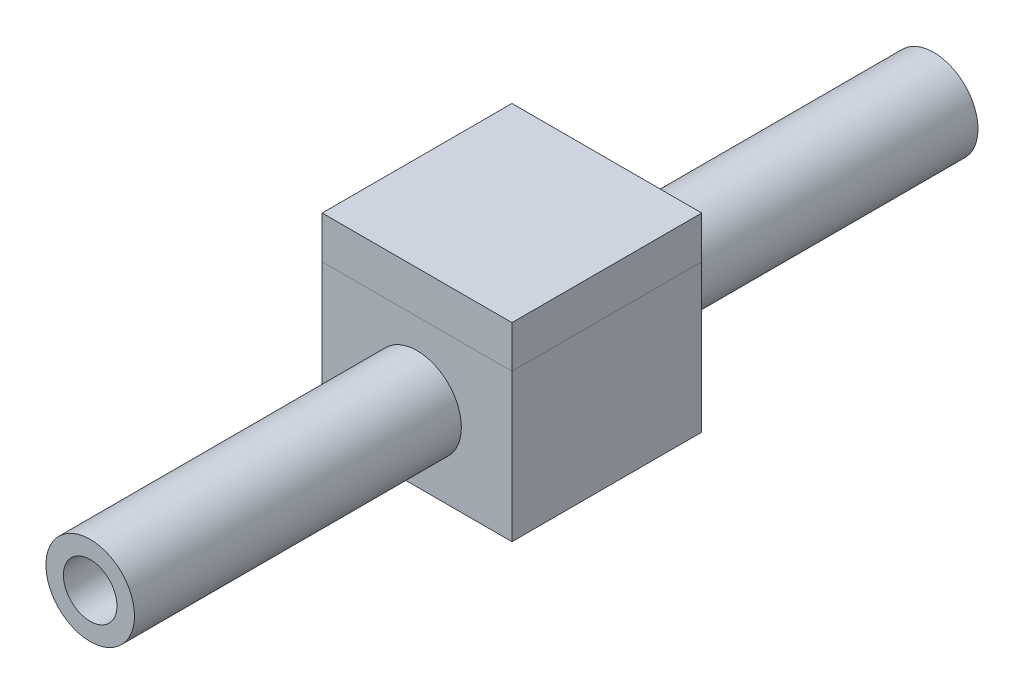
ISO-10303-21;
HEADER;
FILE_DESCRIPTION(('STEP AP214'),'2;1');
FILE_NAME('part.step','',(''),(''),'','','');
FILE_SCHEMA(('AUTOMOTIVE_DESIGN { 1 0 10303 214 1 1 1 1 }'));
ENDSEC;
DATA;
#1=APPLICATION_CONTEXT('core data for automotive mechanical design processes');
#2=APPLICATION_PROTOCOL_DEFINITION('international standard','automotive_design',2000,#1);
#3=PRODUCT_CONTEXT('',#1,'mechanical');
#4=PRODUCT('Part','Part','',(#3));
#5=PRODUCT_RELATED_PRODUCT_CATEGORY('part','',(#4));
#6=PRODUCT_DEFINITION_FORMATION('','',#4);
#7=PRODUCT_DEFINITION_CONTEXT('part definition',#1,'design');
#8=PRODUCT_DEFINITION('design','',#6,#7);
#9=PRODUCT_DEFINITION_SHAPE('','',#8);
#10=(LENGTH_UNIT() NAMED_UNIT(*) SI_UNIT(.MILLI.,.METRE.));
#11=(NAMED_UNIT(*) PLANE_ANGLE_UNIT() SI_UNIT($,.RADIAN.));
#12=(NAMED_UNIT(*) SI_UNIT($,.STERADIAN.) SOLID_ANGLE_UNIT());
#13=UNCERTAINTY_MEASURE_WITH_UNIT(LENGTH_MEASURE(1.E-05),#10,'distance_accuracy_value','');
#14=(GEOMETRIC_REPRESENTATION_CONTEXT(3) GLOBAL_UNCERTAINTY_ASSIGNED_CONTEXT((#13)) GLOBAL_UNIT_ASSIGNED_CONTEXT((#10,
#11,#12)) REPRESENTATION_CONTEXT('',''));
#15=CARTESIAN_POINT('',(0.,0.,0.));
#16=DIRECTION('',(0.,0.,1.));
#17=DIRECTION('',(1.,0.,0.));
#18=AXIS2_PLACEMENT_3D('',#15,#16,#17);
#19=CARTESIAN_POINT('',(-22.5,0.,45.));
#20=DIRECTION('',(1.,0.,0.));
#21=DIRECTION('',(0.,0.,-1.));
#22=AXIS2_PLACEMENT_3D('',#19,#20,#21);
#23=PLANE('',#22);
#24=DIRECTION('',(0.,-1.,0.));
#25=VECTOR('',#24,1.);
#26=CARTESIAN_POINT('',(-22.5,0.,0.));
#27=LINE('',#26,#25);
#28=CARTESIAN_POINT('',(-22.5,27.5,0.));
#29=VERTEX_POINT('',#28);
#30=CARTESIAN_POINT('',(-22.5,17.5,0.));
#31=VERTEX_POINT('',#30);
#32=EDGE_CURVE('E112',#29,#31,#27,.T.);
#33=ORIENTED_EDGE('',*,*,#32,.T.);
#34=DIRECTION('',(0.,0.,-1.));
#35=VECTOR('',#34,1.);
#36=CARTESIAN_POINT('',(-22.5,17.5,45.));
#37=LINE('',#36,#35);
#38=CARTESIAN_POINT('',(-22.5,17.5,45.));
#39=VERTEX_POINT('',#38);
#40=EDGE_CURVE('E12',#39,#31,#37,.T.);
#41=ORIENTED_EDGE('',*,*,#40,.F.);
#42=DIRECTION('',(0.,-1.,0.));
#43=VECTOR('',#42,1.);
#44=CARTESIAN_POINT('',(-22.5,0.,45.));
#45=LINE('',#44,#43);
#46=CARTESIAN_POINT('',(-22.5,27.5,45.));
#47=VERTEX_POINT('',#46);
#48=EDGE_CURVE('E100',#47,#39,#45,.T.);
#49=ORIENTED_EDGE('',*,*,#48,.F.);
#50=DIRECTION('',(0.,0.,-1.));
#51=VECTOR('',#50,1.);
#52=CARTESIAN_POINT('',(-22.5,27.5,45.));
#53=LINE('',#52,#51);
#54=EDGE_CURVE('E108',#47,#29,#53,.T.);
#55=ORIENTED_EDGE('',*,*,#54,.T.);
#56=EDGE_LOOP('',(#33,#41,#49,#55));
#57=FACE_BOUND('',#56,.T.);
#58=ADVANCED_FACE('F49',(#57),#23,.F.);
#59=CARTESIAN_POINT('',(0.,17.5,45.));
#60=DIRECTION('',(0.,1.,0.));
#61=DIRECTION('',(-1.,0.,0.));
#62=AXIS2_PLACEMENT_3D('',#59,#60,#61);
#63=PLANE('',#62);
#64=DIRECTION('',(1.,0.,0.));
#65=VECTOR('',#64,1.);
#66=CARTESIAN_POINT('',(0.,17.5,0.));
#67=LINE('',#66,#65);
#68=CARTESIAN_POINT('',(22.5,17.5,0.));
#69=VERTEX_POINT('',#68);
#70=EDGE_CURVE('E104',#31,#69,#67,.T.);
#71=ORIENTED_EDGE('',*,*,#70,.T.);
#72=DIRECTION('',(0.,0.,-1.));
#73=VECTOR('',#72,1.);
#74=CARTESIAN_POINT('',(22.5,17.5,45.));
#75=LINE('',#74,#73);
#76=CARTESIAN_POINT('',(22.5,17.5,45.));
#77=VERTEX_POINT('',#76);
#78=EDGE_CURVE('E57',#77,#69,#75,.T.);
#79=ORIENTED_EDGE('',*,*,#78,.F.);
#80=DIRECTION('',(1.,0.,0.));
#81=VECTOR('',#80,1.);
#82=CARTESIAN_POINT('',(0.,17.5,45.));
#83=LINE('',#82,#81);
#84=EDGE_CURVE('E95',#39,#77,#83,.T.);
#85=ORIENTED_EDGE('',*,*,#84,.F.);
#86=ORIENTED_EDGE('',*,*,#40,.T.);
#87=EDGE_LOOP('',(#71,#79,#85,#86));
#88=FACE_BOUND('',#87,.T.);
#89=ADVANCED_FACE('F103',(#88),#63,.F.);
#90=CARTESIAN_POINT('',(22.5,0.,45.));
#91=DIRECTION('',(-1.,0.,0.));
#92=DIRECTION('',(0.,0.,1.));
#93=AXIS2_PLACEMENT_3D('',#90,#91,#92);
#94=PLANE('',#93);
#95=DIRECTION('',(0.,1.,0.));
#96=VECTOR('',#95,1.);
#97=CARTESIAN_POINT('',(22.5,0.,0.));
#98=LINE('',#97,#96);
#99=CARTESIAN_POINT('',(22.5,27.5,0.));
#100=VERTEX_POINT('',#99);
#101=EDGE_CURVE('E82',#69,#100,#98,.T.);
#102=ORIENTED_EDGE('',*,*,#101,.T.);
#103=DIRECTION('',(0.,0.,-1.));
#104=VECTOR('',#103,1.);
#105=CARTESIAN_POINT('',(22.5,27.5,45.));
#106=LINE('',#105,#104);
#107=CARTESIAN_POINT('',(22.5,27.5,45.));
#108=VERTEX_POINT('',#107);
#109=EDGE_CURVE('E105',#108,#100,#106,.T.);
#110=ORIENTED_EDGE('',*,*,#109,.F.);
#111=DIRECTION('',(0.,1.,0.));
#112=VECTOR('',#111,1.);
#113=CARTESIAN_POINT('',(22.5,0.,45.));
#114=LINE('',#113,#112);
#115=EDGE_CURVE('E98',#77,#108,#114,.T.);
#116=ORIENTED_EDGE('',*,*,#115,.F.);
#117=ORIENTED_EDGE('',*,*,#78,.T.);
#118=EDGE_LOOP('',(#102,#110,#116,#117));
#119=FACE_BOUND('',#118,.T.);
#120=ADVANCED_FACE('F106',(#119),#94,.F.);
#121=CARTESIAN_POINT('',(0.,27.5,45.));
#122=DIRECTION('',(0.,-1.,0.));
#123=DIRECTION('',(1.,0.,0.));
#124=AXIS2_PLACEMENT_3D('',#121,#122,#123);
#125=PLANE('',#124);
#126=DIRECTION('',(-1.,0.,0.));
#127=VECTOR('',#126,1.);
#128=CARTESIAN_POINT('',(0.,27.5,0.));
#129=LINE('',#128,#127);
#130=EDGE_CURVE('E88',#100,#29,#129,.T.);
#131=ORIENTED_EDGE('',*,*,#130,.T.);
#132=ORIENTED_EDGE('',*,*,#54,.F.);
#133=DIRECTION('',(-1.,0.,0.));
#134=VECTOR('',#133,1.);
#135=CARTESIAN_POINT('',(0.,27.5,45.));
#136=LINE('',#135,#134);
#137=EDGE_CURVE('E65',#108,#47,#136,.T.);
#138=ORIENTED_EDGE('',*,*,#137,.F.);
#139=ORIENTED_EDGE('',*,*,#109,.T.);
#140=EDGE_LOOP('',(#131,#132,#138,#139));
#141=FACE_BOUND('',#140,.T.);
#142=ADVANCED_FACE('F119',(#141),#125,.F.);
#143=CARTESIAN_POINT('',(0.,0.,45.));
#144=DIRECTION('',(0.,0.,1.));
#145=DIRECTION('',(1.,0.,0.));
#146=AXIS2_PLACEMENT_3D('',#143,#144,#145);
#147=PLANE('',#146);
#148=ORIENTED_EDGE('',*,*,#48,.T.);
#149=ORIENTED_EDGE('',*,*,#84,.T.);
#150=ORIENTED_EDGE('',*,*,#115,.T.);
#151=ORIENTED_EDGE('',*,*,#137,.T.);
#152=EDGE_LOOP('',(#148,#149,#150,#151));
#153=FACE_BOUND('',#152,.T.);
#154=ADVANCED_FACE('F96',(#153),#147,.T.);
#155=CARTESIAN_POINT('',(0.,0.,0.));
#156=DIRECTION('',(0.,0.,1.));
#157=DIRECTION('',(1.,0.,0.));
#158=AXIS2_PLACEMENT_3D('',#155,#156,#157);
#159=PLANE('',#158);
#160=ORIENTED_EDGE('',*,*,#32,.F.);
#161=ORIENTED_EDGE('',*,*,#130,.F.);
#162=ORIENTED_EDGE('',*,*,#101,.F.);
#163=ORIENTED_EDGE('',*,*,#70,.F.);
#164=EDGE_LOOP('',(#160,#161,#162,#163));
#165=FACE_BOUND('',#164,.T.);
#166=ADVANCED_FACE('F122',(#165),#159,.F.);
#167=CLOSED_SHELL('',(#58,#89,#120,#142,#154,#166));
#168=MANIFOLD_SOLID_BREP('B2',#167);
#169=CARTESIAN_POINT('',(-22.5,0.,45.));
#170=DIRECTION('',(1.,0.,0.));
#171=DIRECTION('',(0.,0.,-1.));
#172=AXIS2_PLACEMENT_3D('',#169,#170,#171);
#173=PLANE('',#172);
#174=DIRECTION('',(0.,-1.,0.));
#175=VECTOR('',#174,1.);
#176=CARTESIAN_POINT('',(-22.5,0.,0.));
#177=LINE('',#176,#175);
#178=CARTESIAN_POINT('',(-22.5,17.5,0.));
#179=VERTEX_POINT('',#178);
#180=CARTESIAN_POINT('',(-22.5,-17.5,0.));
#181=VERTEX_POINT('',#180);
#182=EDGE_CURVE('E248',#179,#181,#177,.T.);
#183=ORIENTED_EDGE('',*,*,#182,.T.);
#184=DIRECTION('',(0.,0.,-1.));
#185=VECTOR('',#184,1.);
#186=CARTESIAN_POINT('',(-22.5,-17.5,45.));
#187=LINE('',#186,#185);
#188=CARTESIAN_POINT('',(-22.5,-17.5,45.));
#189=VERTEX_POINT('',#188);
#190=EDGE_CURVE('E47',#189,#181,#187,.T.);
#191=ORIENTED_EDGE('',*,*,#190,.F.);
#192=DIRECTION('',(0.,-1.,0.));
#193=VECTOR('',#192,1.);
#194=CARTESIAN_POINT('',(-22.5,0.,45.));
#195=LINE('',#194,#193);
#196=CARTESIAN_POINT('',(-22.5,17.5,45.));
#197=VERTEX_POINT('',#196);
#198=EDGE_CURVE('E234',#197,#189,#195,.T.);
#199=ORIENTED_EDGE('',*,*,#198,.F.);
#200=DIRECTION('',(0.,0.,-1.));
#201=VECTOR('',#200,1.);
#202=CARTESIAN_POINT('',(-22.5,17.5,45.));
#203=LINE('',#202,#201);
#204=EDGE_CURVE('E201',#197,#179,#203,.T.);
#205=ORIENTED_EDGE('',*,*,#204,.T.);
#206=EDGE_LOOP('',(#183,#191,#199,#205));
#207=FACE_BOUND('',#206,.T.);
#208=ADVANCED_FACE('F185',(#207),#173,.F.);
#209=CARTESIAN_POINT('',(0.,-17.5,45.));
#210=DIRECTION('',(0.,1.,0.));
#211=DIRECTION('',(-1.,0.,0.));
#212=AXIS2_PLACEMENT_3D('',#209,#210,#211);
#213=PLANE('',#212);
#214=DIRECTION('',(1.,0.,0.));
#215=VECTOR('',#214,1.);
#216=CARTESIAN_POINT('',(0.,-17.5,0.));
#217=LINE('',#216,#215);
#218=CARTESIAN_POINT('',(22.5,-17.5,0.));
#219=VERTEX_POINT('',#218);
#220=EDGE_CURVE('E239',#181,#219,#217,.T.);
#221=ORIENTED_EDGE('',*,*,#220,.T.);
#222=DIRECTION('',(0.,0.,-1.));
#223=VECTOR('',#222,1.);
#224=CARTESIAN_POINT('',(22.5,-17.5,45.));
#225=LINE('',#224,#223);
#226=CARTESIAN_POINT('',(22.5,-17.5,45.));
#227=VERTEX_POINT('',#226);
#228=EDGE_CURVE('E193',#227,#219,#225,.T.);
#229=ORIENTED_EDGE('',*,*,#228,.F.);
#230=DIRECTION('',(1.,0.,0.));
#231=VECTOR('',#230,1.);
#232=CARTESIAN_POINT('',(0.,-17.5,45.));
#233=LINE('',#232,#231);
#234=EDGE_CURVE('E227',#189,#227,#233,.T.);
#235=ORIENTED_EDGE('',*,*,#234,.F.);
#236=ORIENTED_EDGE('',*,*,#190,.T.);
#237=EDGE_LOOP('',(#221,#229,#235,#236));
#238=FACE_BOUND('',#237,.T.);
#239=ADVANCED_FACE('F238',(#238),#213,.F.);
#240=CARTESIAN_POINT('',(22.5,0.,45.));
#241=DIRECTION('',(-1.,0.,0.));
#242=DIRECTION('',(0.,0.,1.));
#243=AXIS2_PLACEMENT_3D('',#240,#241,#242);
#244=PLANE('',#243);
#245=DIRECTION('',(0.,1.,0.));
#246=VECTOR('',#245,1.);
#247=CARTESIAN_POINT('',(22.5,0.,0.));
#248=LINE('',#247,#246);
#249=CARTESIAN_POINT('',(22.5,17.5,0.));
#250=VERTEX_POINT('',#249);
#251=EDGE_CURVE('E252',#219,#250,#248,.T.);
#252=ORIENTED_EDGE('',*,*,#251,.T.);
#253=DIRECTION('',(0.,0.,-1.));
#254=VECTOR('',#253,1.);
#255=CARTESIAN_POINT('',(22.5,17.5,45.));
#256=LINE('',#255,#254);
#257=CARTESIAN_POINT('',(22.5,17.5,45.));
#258=VERTEX_POINT('',#257);
#259=EDGE_CURVE('E216',#258,#250,#256,.T.);
#260=ORIENTED_EDGE('',*,*,#259,.F.);
#261=DIRECTION('',(0.,1.,0.));
#262=VECTOR('',#261,1.);
#263=CARTESIAN_POINT('',(22.5,0.,45.));
#264=LINE('',#263,#262);
#265=EDGE_CURVE('E233',#227,#258,#264,.T.);
#266=ORIENTED_EDGE('',*,*,#265,.F.);
#267=ORIENTED_EDGE('',*,*,#228,.T.);
#268=EDGE_LOOP('',(#252,#260,#266,#267));
#269=FACE_BOUND('',#268,.T.);
#270=ADVANCED_FACE('F242',(#269),#244,.F.);
#271=CARTESIAN_POINT('',(0.,17.5,45.));
#272=DIRECTION('',(0.,1.,0.));
#273=DIRECTION('',(-1.,0.,0.));
#274=AXIS2_PLACEMENT_3D('',#271,#272,#273);
#275=PLANE('',#274);
#276=DIRECTION('',(1.,0.,0.));
#277=VECTOR('',#276,1.);
#278=CARTESIAN_POINT('',(0.,17.5,0.));
#279=LINE('',#278,#277);
#280=EDGE_CURVE('E254',#179,#250,#279,.T.);
#281=ORIENTED_EDGE('',*,*,#280,.F.);
#282=ORIENTED_EDGE('',*,*,#204,.F.);
#283=DIRECTION('',(1.,0.,0.));
#284=VECTOR('',#283,1.);
#285=CARTESIAN_POINT('',(0.,17.5,45.));
#286=LINE('',#285,#284);
#287=EDGE_CURVE('E243',#197,#258,#286,.T.);
#288=ORIENTED_EDGE('',*,*,#287,.T.);
#289=ORIENTED_EDGE('',*,*,#259,.T.);
#290=EDGE_LOOP('',(#281,#282,#288,#289));
#291=FACE_BOUND('',#290,.T.);
#292=ADVANCED_FACE('F295',(#291),#275,.T.);
#293=CARTESIAN_POINT('',(0.,0.,45.));
#294=DIRECTION('',(0.,0.,1.));
#295=DIRECTION('',(1.,0.,0.));
#296=AXIS2_PLACEMENT_3D('',#293,#294,#295);
#297=PLANE('',#296);
#298=CARTESIAN_POINT('',(0.,0.,45.));
#299=DIRECTION('',(0.,0.,1.));
#300=DIRECTION('',(1.,0.,0.));
#301=AXIS2_PLACEMENT_3D('',#298,#299,#300);
#302=CIRCLE('',#301,10.5);
#303=CARTESIAN_POINT('',(10.5,0.,45.));
#304=VERTEX_POINT('',#303);
#305=EDGE_CURVE('E269',#304,#304,#302,.T.);
#306=ORIENTED_EDGE('',*,*,#305,.F.);
#307=EDGE_LOOP('',(#306));
#308=FACE_BOUND('',#307,.T.);
#309=ORIENTED_EDGE('',*,*,#198,.T.);
#310=ORIENTED_EDGE('',*,*,#234,.T.);
#311=ORIENTED_EDGE('',*,*,#265,.T.);
#312=ORIENTED_EDGE('',*,*,#287,.F.);
#313=EDGE_LOOP('',(#309,#310,#311,#312));
#314=FACE_BOUND('',#313,.T.);
#315=ADVANCED_FACE('F230',(#308,#314),#297,.T.);
#316=CARTESIAN_POINT('',(0.,0.,0.));
#317=DIRECTION('',(0.,0.,1.));
#318=DIRECTION('',(1.,0.,0.));
#319=AXIS2_PLACEMENT_3D('',#316,#317,#318);
#320=PLANE('',#319);
#321=CARTESIAN_POINT('',(0.,0.,0.));
#322=DIRECTION('',(0.,0.,1.));
#323=DIRECTION('',(1.,0.,0.));
#324=AXIS2_PLACEMENT_3D('',#321,#322,#323);
#325=CIRCLE('',#324,10.5);
#326=CARTESIAN_POINT('',(10.5,0.,0.));
#327=VERTEX_POINT('',#326);
#328=EDGE_CURVE('E260',#327,#327,#325,.T.);
#329=ORIENTED_EDGE('',*,*,#328,.T.);
#330=EDGE_LOOP('',(#329));
#331=FACE_BOUND('',#330,.T.);
#332=ORIENTED_EDGE('',*,*,#182,.F.);
#333=ORIENTED_EDGE('',*,*,#280,.T.);
#334=ORIENTED_EDGE('',*,*,#251,.F.);
#335=ORIENTED_EDGE('',*,*,#220,.F.);
#336=EDGE_LOOP('',(#332,#333,#334,#335));
#337=FACE_BOUND('',#336,.T.);
#338=ADVANCED_FACE('F294',(#331,#337),#320,.F.);
#339=CARTESIAN_POINT('',(0.,0.,45.));
#340=DIRECTION('',(0.,0.,-1.));
#341=DIRECTION('',(-1.,0.,0.));
#342=AXIS2_PLACEMENT_3D('',#339,#340,#341);
#343=CYLINDRICAL_SURFACE('',#342,6.35);
#344=CARTESIAN_POINT('',(0.,0.,-77.5));
#345=DIRECTION('',(0.,0.,-1.));
#346=DIRECTION('',(-1.,0.,0.));
#347=AXIS2_PLACEMENT_3D('',#344,#345,#346);
#348=CIRCLE('',#347,6.35);
#349=CARTESIAN_POINT('',(-6.35,0.,-77.5));
#350=VERTEX_POINT('',#349);
#351=EDGE_CURVE('E263',#350,#350,#348,.T.);
#352=CARTESIAN_POINT('',(0.,0.,122.5));
#353=DIRECTION('',(0.,0.,1.));
#354=DIRECTION('',(1.,0.,0.));
#355=AXIS2_PLACEMENT_3D('',#352,#353,#354);
#356=CIRCLE('',#355,6.35);
#357=CARTESIAN_POINT('',(-6.35,0.,122.5));
#358=VERTEX_POINT('',#357);
#359=EDGE_CURVE('E272',#358,#358,#356,.T.);
#360=CARTESIAN_POINT('',(-6.35,0.,-77.5));
#361=CARTESIAN_POINT('',(-6.35,0.,-75.4166666666666));
#362=CARTESIAN_POINT('',(-6.35,0.,-73.3333333333333));
#363=CARTESIAN_POINT('',(-6.35,0.,-69.1666666666667));
#364=CARTESIAN_POINT('',(-6.35,0.,-67.0833333333333));
#365=CARTESIAN_POINT('',(-6.35,0.,-62.9166666666667));
#366=CARTESIAN_POINT('',(-6.35,0.,-60.8333333333333));
#367=CARTESIAN_POINT('',(-6.35,0.,-56.6666666666667));
#368=CARTESIAN_POINT('',(-6.35,0.,-54.5833333333333));
#369=CARTESIAN_POINT('',(-6.35,0.,-50.4166666666667));
#370=CARTESIAN_POINT('',(-6.35,0.,-48.3333333333333));
#371=CARTESIAN_POINT('',(-6.35,0.,-44.1666666666667));
#372=CARTESIAN_POINT('',(-6.35,0.,-42.0833333333333));
#373=CARTESIAN_POINT('',(-6.35,0.,-37.9166666666667));
#374=CARTESIAN_POINT('',(-6.35,0.,-35.8333333333333));
#375=CARTESIAN_POINT('',(-6.35,0.,-31.6666666666666));
#376=CARTESIAN_POINT('',(-6.35,0.,-29.5833333333333));
#377=CARTESIAN_POINT('',(-6.35,0.,-25.4166666666667));
#378=CARTESIAN_POINT('',(-6.35,0.,-23.3333333333333));
#379=CARTESIAN_POINT('',(-6.35,0.,-19.1666666666667));
#380=CARTESIAN_POINT('',(-6.35,0.,-17.0833333333333));
#381=CARTESIAN_POINT('',(-6.35,0.,-12.9166666666667));
#382=CARTESIAN_POINT('',(-6.35,0.,-10.8333333333333));
#383=CARTESIAN_POINT('',(-6.35,0.,-6.66666666666665));
#384=CARTESIAN_POINT('',(-6.35,0.,-4.58333333333332));
#385=CARTESIAN_POINT('',(-6.35,0.,-0.416666666666651));
#386=CARTESIAN_POINT('',(-6.35,0.,1.66666666666668));
#387=CARTESIAN_POINT('',(-6.35,0.,5.83333333333334));
#388=CARTESIAN_POINT('',(-6.35,0.,7.91666666666668));
#389=CARTESIAN_POINT('',(-6.35,0.,12.0833333333333));
#390=CARTESIAN_POINT('',(-6.35,0.,14.1666666666667));
#391=CARTESIAN_POINT('',(-6.35,0.,18.3333333333333));
#392=CARTESIAN_POINT('',(-6.35,0.,20.4166666666667));
#393=CARTESIAN_POINT('',(-6.35,0.,24.5833333333333));
#394=CARTESIAN_POINT('',(-6.35,0.,26.6666666666667));
#395=CARTESIAN_POINT('',(-6.35,0.,30.8333333333333));
#396=CARTESIAN_POINT('',(-6.35,0.,32.9166666666667));
#397=CARTESIAN_POINT('',(-6.35,0.,37.0833333333333));
#398=CARTESIAN_POINT('',(-6.35,0.,39.1666666666667));
#399=CARTESIAN_POINT('',(-6.35,0.,43.3333333333333));
#400=CARTESIAN_POINT('',(-6.35,0.,45.4166666666667));
#401=CARTESIAN_POINT('',(-6.35,0.,49.5833333333333));
#402=CARTESIAN_POINT('',(-6.35,0.,51.6666666666667));
#403=CARTESIAN_POINT('',(-6.35,0.,55.8333333333333));
#404=CARTESIAN_POINT('',(-6.35,0.,57.9166666666667));
#405=CARTESIAN_POINT('',(-6.35,0.,62.0833333333333));
#406=CARTESIAN_POINT('',(-6.35,0.,64.1666666666667));
#407=CARTESIAN_POINT('',(-6.35,0.,68.3333333333334));
#408=CARTESIAN_POINT('',(-6.35,0.,70.4166666666667));
#409=CARTESIAN_POINT('',(-6.35,0.,74.5833333333333));
#410=CARTESIAN_POINT('',(-6.35,0.,76.6666666666667));
#411=CARTESIAN_POINT('',(-6.35,0.,80.8333333333333));
#412=CARTESIAN_POINT('',(-6.35,0.,82.9166666666667));
#413=CARTESIAN_POINT('',(-6.35,0.,87.0833333333333));
#414=CARTESIAN_POINT('',(-6.35,0.,89.1666666666667));
#415=CARTESIAN_POINT('',(-6.35,0.,93.3333333333333));
#416=CARTESIAN_POINT('',(-6.35,0.,95.4166666666667));
#417=CARTESIAN_POINT('',(-6.35,0.,99.5833333333333));
#418=CARTESIAN_POINT('',(-6.35,0.,101.666666666667));
#419=CARTESIAN_POINT('',(-6.35,0.,105.833333333333));
#420=CARTESIAN_POINT('',(-6.35,0.,107.916666666667));
#421=CARTESIAN_POINT('',(-6.35,0.,112.083333333333));
#422=CARTESIAN_POINT('',(-6.35,0.,114.166666666667));
#423=CARTESIAN_POINT('',(-6.35,0.,118.333333333333));
#424=CARTESIAN_POINT('',(-6.35,0.,120.416666666667));
#425=CARTESIAN_POINT('',(-6.35,0.,122.5));
#426=B_SPLINE_CURVE_WITH_KNOTS('',3,(#360,#361,#362,#363,#364,#365,#366,#367,#368,#369,#370,
#371,#372,#373,#374,#375,#376,#377,#378,#379,#380,#381,#382,#383,#384,#385,#386,#387,#388,#389,
#390,#391,#392,#393,#394,#395,#396,#397,#398,#399,#400,#401,#402,#403,#404,#405,#406,#407,#408,
#409,#410,#411,#412,#413,#414,#415,#416,#417,#418,#419,#420,#421,#422,#423,#424,#425),
.UNSPECIFIED.,.F.,.F.,(4,2,2,2,2,2,2,2,2,2,2,2,2,2,2,2,2,2,2,2,2,2,2,2,2,2,2,2,2,2,2,2,4),(0.,
6.25000000000001,12.5,18.75,25.,31.25,37.5,43.75,50.,56.25,62.5,68.75,75.,81.25,87.5,93.75,100.,
106.25,112.5,118.75,125.,131.25,137.5,143.75,150.,156.25,162.5,168.75,175.,181.25,187.5,193.75,
200.),.UNSPECIFIED.);
#427=EDGE_CURVE('BSEAM278',#350,#358,#426,.T.);
#428=ORIENTED_EDGE('',*,*,#351,.T.);
#429=ORIENTED_EDGE('',*,*,#359,.T.);
#430=ORIENTED_EDGE('',*,*,#427,.T.);
#431=ORIENTED_EDGE('',*,*,#427,.F.);
#432=EDGE_LOOP('',(#428,#430,#429,#431));
#433=FACE_BOUND('',#432,.T.);
#434=ADVANCED_FACE('F278',(#433),#343,.F.);
#435=CARTESIAN_POINT('',(0.,0.,-77.5));
#436=DIRECTION('',(0.,0.,1.));
#437=DIRECTION('',(1.,0.,0.));
#438=AXIS2_PLACEMENT_3D('',#435,#436,#437);
#439=CYLINDRICAL_SURFACE('',#438,10.5);
#440=CARTESIAN_POINT('',(0.,0.,-77.5));
#441=DIRECTION('',(0.,0.,1.));
#442=DIRECTION('',(1.,0.,0.));
#443=AXIS2_PLACEMENT_3D('',#440,#441,#442);
#444=CIRCLE('',#443,10.5);
#445=CARTESIAN_POINT('',(10.5,0.,-77.5));
#446=VERTEX_POINT('',#445);
#447=EDGE_CURVE('E250',#446,#446,#444,.T.);
#448=ORIENTED_EDGE('',*,*,#447,.T.);
#449=EDGE_LOOP('',(#448));
#450=FACE_BOUND('',#449,.T.);
#451=ORIENTED_EDGE('',*,*,#328,.F.);
#452=EDGE_LOOP('',(#451));
#453=FACE_BOUND('',#452,.T.);
#454=ADVANCED_FACE('F335',(#450,#453),#439,.T.);
#455=CARTESIAN_POINT('',(0.,0.,-77.5));
#456=DIRECTION('',(0.,0.,1.));
#457=DIRECTION('',(1.,0.,0.));
#458=AXIS2_PLACEMENT_3D('',#455,#456,#457);
#459=PLANE('',#458);
#460=ORIENTED_EDGE('',*,*,#351,.F.);
#461=EDGE_LOOP('',(#460));
#462=FACE_BOUND('',#461,.T.);
#463=ORIENTED_EDGE('',*,*,#447,.F.);
#464=EDGE_LOOP('',(#463));
#465=FACE_BOUND('',#464,.T.);
#466=ADVANCED_FACE('F289',(#462,#465),#459,.F.);
#467=CARTESIAN_POINT('',(0.,0.,122.5));
#468=DIRECTION('',(0.,0.,-1.));
#469=DIRECTION('',(-1.,0.,0.));
#470=AXIS2_PLACEMENT_3D('',#467,#468,#469);
#471=CYLINDRICAL_SURFACE('',#470,10.5);
#472=CARTESIAN_POINT('',(0.,0.,122.5));
#473=DIRECTION('',(0.,0.,1.));
#474=DIRECTION('',(1.,0.,0.));
#475=AXIS2_PLACEMENT_3D('',#472,#473,#474);
#476=CIRCLE('',#475,10.5);
#477=CARTESIAN_POINT('',(10.5,0.,122.5));
#478=VERTEX_POINT('',#477);
#479=EDGE_CURVE('E268',#478,#478,#476,.T.);
#480=ORIENTED_EDGE('',*,*,#479,.F.);
#481=EDGE_LOOP('',(#480));
#482=FACE_BOUND('',#481,.T.);
#483=ORIENTED_EDGE('',*,*,#305,.T.);
#484=EDGE_LOOP('',(#483));
#485=FACE_BOUND('',#484,.T.);
#486=ADVANCED_FACE('F283',(#482,#485),#471,.T.);
#487=CARTESIAN_POINT('',(0.,0.,122.5));
#488=DIRECTION('',(0.,0.,1.));
#489=DIRECTION('',(1.,0.,0.));
#490=AXIS2_PLACEMENT_3D('',#487,#488,#489);
#491=PLANE('',#490);
#492=ORIENTED_EDGE('',*,*,#359,.F.);
#493=EDGE_LOOP('',(#492));
#494=FACE_BOUND('',#493,.T.);
#495=ORIENTED_EDGE('',*,*,#479,.T.);
#496=EDGE_LOOP('',(#495));
#497=FACE_BOUND('',#496,.T.);
#498=ADVANCED_FACE('F280',(#494,#497),#491,.T.);
#499=CLOSED_SHELL('',(#208,#239,#270,#292,#315,#338,#434,#454,#466,#486,#498));
#500=MANIFOLD_SOLID_BREP('B6',#499);
#501=ADVANCED_BREP_SHAPE_REPRESENTATION('',(#18,#168,#500),#14);
#502=SHAPE_DEFINITION_REPRESENTATION(#9,#501);
ENDSEC;
END-ISO-10303-21;
